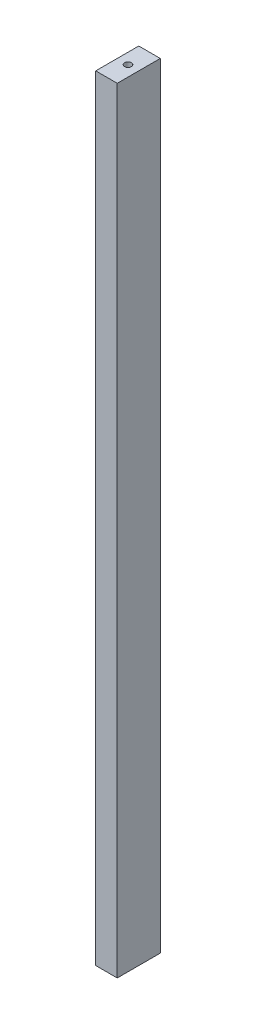
ISO-10303-21;
HEADER;
FILE_DESCRIPTION(('STEP AP214'),'2;1');
FILE_NAME('part.step','',(''),(''),'','','');
FILE_SCHEMA(('AUTOMOTIVE_DESIGN { 1 0 10303 214 1 1 1 1 }'));
ENDSEC;
DATA;
#1=APPLICATION_CONTEXT('core data for automotive mechanical design processes');
#2=APPLICATION_PROTOCOL_DEFINITION('international standard','automotive_design',2000,#1);
#3=PRODUCT_CONTEXT('',#1,'mechanical');
#4=PRODUCT('Part','Part','',(#3));
#5=PRODUCT_RELATED_PRODUCT_CATEGORY('part','',(#4));
#6=PRODUCT_DEFINITION_FORMATION('','',#4);
#7=PRODUCT_DEFINITION_CONTEXT('part definition',#1,'design');
#8=PRODUCT_DEFINITION('design','',#6,#7);
#9=PRODUCT_DEFINITION_SHAPE('','',#8);
#10=(LENGTH_UNIT() NAMED_UNIT(*) SI_UNIT(.MILLI.,.METRE.));
#11=(NAMED_UNIT(*) PLANE_ANGLE_UNIT() SI_UNIT($,.RADIAN.));
#12=(NAMED_UNIT(*) SI_UNIT($,.STERADIAN.) SOLID_ANGLE_UNIT());
#13=UNCERTAINTY_MEASURE_WITH_UNIT(LENGTH_MEASURE(1.E-05),#10,'distance_accuracy_value','');
#14=(GEOMETRIC_REPRESENTATION_CONTEXT(3) GLOBAL_UNCERTAINTY_ASSIGNED_CONTEXT((#13)) GLOBAL_UNIT_ASSIGNED_CONTEXT((#10,
#11,#12)) REPRESENTATION_CONTEXT('',''));
#15=CARTESIAN_POINT('',(0.,0.,0.));
#16=DIRECTION('',(0.,0.,1.));
#17=DIRECTION('',(1.,0.,0.));
#18=AXIS2_PLACEMENT_3D('',#15,#16,#17);
#19=CARTESIAN_POINT('',(-12.5,900.,-25.));
#20=DIRECTION('',(1.,0.,0.));
#21=DIRECTION('',(0.,0.,-1.));
#22=AXIS2_PLACEMENT_3D('',#19,#20,#21);
#23=PLANE('',#22);
#24=DIRECTION('',(0.,0.,1.));
#25=VECTOR('',#24,1.);
#26=CARTESIAN_POINT('',(-12.5,0.,-25.));
#27=LINE('',#26,#25);
#28=CARTESIAN_POINT('',(-12.5,0.,-25.));
#29=VERTEX_POINT('',#28);
#30=CARTESIAN_POINT('',(-12.5,0.,25.));
#31=VERTEX_POINT('',#30);
#32=EDGE_CURVE('E111',#29,#31,#27,.T.);
#33=ORIENTED_EDGE('',*,*,#32,.T.);
#34=DIRECTION('',(0.,-1.,0.));
#35=VECTOR('',#34,1.);
#36=CARTESIAN_POINT('',(-12.5,900.,25.));
#37=LINE('',#36,#35);
#38=CARTESIAN_POINT('',(-12.5,900.,25.));
#39=VERTEX_POINT('',#38);
#40=EDGE_CURVE('E11',#39,#31,#37,.T.);
#41=ORIENTED_EDGE('',*,*,#40,.F.);
#42=DIRECTION('',(0.,0.,1.));
#43=VECTOR('',#42,1.);
#44=CARTESIAN_POINT('',(-12.5,900.,-25.));
#45=LINE('',#44,#43);
#46=CARTESIAN_POINT('',(-12.5,900.,-25.));
#47=VERTEX_POINT('',#46);
#48=EDGE_CURVE('E95',#47,#39,#45,.T.);
#49=ORIENTED_EDGE('',*,*,#48,.F.);
#50=DIRECTION('',(0.,-1.,0.));
#51=VECTOR('',#50,1.);
#52=CARTESIAN_POINT('',(-12.5,900.,-25.));
#53=LINE('',#52,#51);
#54=EDGE_CURVE('E107',#47,#29,#53,.T.);
#55=ORIENTED_EDGE('',*,*,#54,.T.);
#56=EDGE_LOOP('',(#33,#41,#49,#55));
#57=FACE_BOUND('',#56,.T.);
#58=ADVANCED_FACE('F43',(#57),#23,.F.);
#59=CARTESIAN_POINT('',(12.5,900.,25.));
#60=DIRECTION('',(0.,0.,-1.));
#61=DIRECTION('',(-1.,0.,0.));
#62=AXIS2_PLACEMENT_3D('',#59,#60,#61);
#63=PLANE('',#62);
#64=DIRECTION('',(1.,0.,0.));
#65=VECTOR('',#64,1.);
#66=CARTESIAN_POINT('',(12.5,0.,25.));
#67=LINE('',#66,#65);
#68=CARTESIAN_POINT('',(12.5,0.,25.));
#69=VERTEX_POINT('',#68);
#70=EDGE_CURVE('E100',#31,#69,#67,.T.);
#71=ORIENTED_EDGE('',*,*,#70,.T.);
#72=DIRECTION('',(0.,-1.,0.));
#73=VECTOR('',#72,1.);
#74=CARTESIAN_POINT('',(12.5,900.,25.));
#75=LINE('',#74,#73);
#76=CARTESIAN_POINT('',(12.5,900.,25.));
#77=VERTEX_POINT('',#76);
#78=EDGE_CURVE('E52',#77,#69,#75,.T.);
#79=ORIENTED_EDGE('',*,*,#78,.F.);
#80=DIRECTION('',(1.,0.,0.));
#81=VECTOR('',#80,1.);
#82=CARTESIAN_POINT('',(12.5,900.,25.));
#83=LINE('',#82,#81);
#84=EDGE_CURVE('E90',#39,#77,#83,.T.);
#85=ORIENTED_EDGE('',*,*,#84,.F.);
#86=ORIENTED_EDGE('',*,*,#40,.T.);
#87=EDGE_LOOP('',(#71,#79,#85,#86));
#88=FACE_BOUND('',#87,.T.);
#89=ADVANCED_FACE('F99',(#88),#63,.F.);
#90=CARTESIAN_POINT('',(12.5,900.,-25.));
#91=DIRECTION('',(-1.,0.,0.));
#92=DIRECTION('',(0.,0.,1.));
#93=AXIS2_PLACEMENT_3D('',#90,#91,#92);
#94=PLANE('',#93);
#95=DIRECTION('',(0.,0.,-1.));
#96=VECTOR('',#95,1.);
#97=CARTESIAN_POINT('',(12.5,0.,-25.));
#98=LINE('',#97,#96);
#99=CARTESIAN_POINT('',(12.5,0.,-25.));
#100=VERTEX_POINT('',#99);
#101=EDGE_CURVE('E77',#69,#100,#98,.T.);
#102=ORIENTED_EDGE('',*,*,#101,.T.);
#103=DIRECTION('',(0.,-1.,0.));
#104=VECTOR('',#103,1.);
#105=CARTESIAN_POINT('',(12.5,900.,-25.));
#106=LINE('',#105,#104);
#107=CARTESIAN_POINT('',(12.5,900.,-25.));
#108=VERTEX_POINT('',#107);
#109=EDGE_CURVE('E102',#108,#100,#106,.T.);
#110=ORIENTED_EDGE('',*,*,#109,.F.);
#111=DIRECTION('',(0.,0.,-1.));
#112=VECTOR('',#111,1.);
#113=CARTESIAN_POINT('',(12.5,900.,-25.));
#114=LINE('',#113,#112);
#115=EDGE_CURVE('E93',#77,#108,#114,.T.);
#116=ORIENTED_EDGE('',*,*,#115,.F.);
#117=ORIENTED_EDGE('',*,*,#78,.T.);
#118=EDGE_LOOP('',(#102,#110,#116,#117));
#119=FACE_BOUND('',#118,.T.);
#120=ADVANCED_FACE('F103',(#119),#94,.F.);
#121=CARTESIAN_POINT('',(12.5,900.,-25.));
#122=DIRECTION('',(0.,0.,1.));
#123=DIRECTION('',(1.,0.,0.));
#124=AXIS2_PLACEMENT_3D('',#121,#122,#123);
#125=PLANE('',#124);
#126=DIRECTION('',(-1.,0.,0.));
#127=VECTOR('',#126,1.);
#128=CARTESIAN_POINT('',(12.5,0.,-25.));
#129=LINE('',#128,#127);
#130=EDGE_CURVE('E83',#100,#29,#129,.T.);
#131=ORIENTED_EDGE('',*,*,#130,.T.);
#132=ORIENTED_EDGE('',*,*,#54,.F.);
#133=DIRECTION('',(-1.,0.,0.));
#134=VECTOR('',#133,1.);
#135=CARTESIAN_POINT('',(12.5,900.,-25.));
#136=LINE('',#135,#134);
#137=EDGE_CURVE('E60',#108,#47,#136,.T.);
#138=ORIENTED_EDGE('',*,*,#137,.F.);
#139=ORIENTED_EDGE('',*,*,#109,.T.);
#140=EDGE_LOOP('',(#131,#132,#138,#139));
#141=FACE_BOUND('',#140,.T.);
#142=ADVANCED_FACE('F125',(#141),#125,.F.);
#143=CARTESIAN_POINT('',(0.,900.,0.));
#144=DIRECTION('',(0.,-1.,0.));
#145=DIRECTION('',(0.,0.,-1.));
#146=AXIS2_PLACEMENT_3D('',#143,#144,#145);
#147=PLANE('',#146);
#148=CARTESIAN_POINT('',(0.,900.,0.));
#149=DIRECTION('',(0.,1.,0.));
#150=DIRECTION('',(0.,0.,1.));
#151=AXIS2_PLACEMENT_3D('',#148,#149,#150);
#152=CIRCLE('',#151,4.);
#153=CARTESIAN_POINT('',(0.,900.,4.));
#154=VERTEX_POINT('',#153);
#155=EDGE_CURVE('E140',#154,#154,#152,.T.);
#156=ORIENTED_EDGE('',*,*,#155,.F.);
#157=EDGE_LOOP('',(#156));
#158=FACE_BOUND('',#157,.T.);
#159=ORIENTED_EDGE('',*,*,#48,.T.);
#160=ORIENTED_EDGE('',*,*,#84,.T.);
#161=ORIENTED_EDGE('',*,*,#115,.T.);
#162=ORIENTED_EDGE('',*,*,#137,.T.);
#163=EDGE_LOOP('',(#159,#160,#161,#162));
#164=FACE_BOUND('',#163,.T.);
#165=ADVANCED_FACE('F91',(#158,#164),#147,.F.);
#166=CARTESIAN_POINT('',(0.,0.,0.));
#167=DIRECTION('',(0.,-1.,0.));
#168=DIRECTION('',(0.,0.,-1.));
#169=AXIS2_PLACEMENT_3D('',#166,#167,#168);
#170=PLANE('',#169);
#171=CARTESIAN_POINT('',(0.,0.,0.));
#172=DIRECTION('',(0.,-1.,0.));
#173=DIRECTION('',(0.,0.,-1.));
#174=AXIS2_PLACEMENT_3D('',#171,#172,#173);
#175=CIRCLE('',#174,4.);
#176=CARTESIAN_POINT('',(0.,0.,-4.));
#177=VERTEX_POINT('',#176);
#178=EDGE_CURVE('E132',#177,#177,#175,.T.);
#179=ORIENTED_EDGE('',*,*,#178,.F.);
#180=EDGE_LOOP('',(#179));
#181=FACE_BOUND('',#180,.T.);
#182=ORIENTED_EDGE('',*,*,#32,.F.);
#183=ORIENTED_EDGE('',*,*,#130,.F.);
#184=ORIENTED_EDGE('',*,*,#101,.F.);
#185=ORIENTED_EDGE('',*,*,#70,.F.);
#186=EDGE_LOOP('',(#182,#183,#184,#185));
#187=FACE_BOUND('',#186,.T.);
#188=ADVANCED_FACE('F128',(#181,#187),#170,.T.);
#189=CARTESIAN_POINT('',(0.,10.,0.));
#190=DIRECTION('',(0.,-1.,0.));
#191=DIRECTION('',(0.,0.,-1.));
#192=AXIS2_PLACEMENT_3D('',#189,#190,#191);
#193=CYLINDRICAL_SURFACE('',#192,4.);
#194=CARTESIAN_POINT('',(0.,10.,0.));
#195=DIRECTION('',(0.,-1.,0.));
#196=DIRECTION('',(0.,0.,-1.));
#197=AXIS2_PLACEMENT_3D('',#194,#195,#196);
#198=CIRCLE('',#197,4.);
#199=CARTESIAN_POINT('',(0.,10.,-4.));
#200=VERTEX_POINT('',#199);
#201=EDGE_CURVE('E115',#200,#200,#198,.T.);
#202=ORIENTED_EDGE('',*,*,#201,.F.);
#203=EDGE_LOOP('',(#202));
#204=FACE_BOUND('',#203,.T.);
#205=ORIENTED_EDGE('',*,*,#178,.T.);
#206=EDGE_LOOP('',(#205));
#207=FACE_BOUND('',#206,.T.);
#208=ADVANCED_FACE('F163',(#204,#207),#193,.F.);
#209=CARTESIAN_POINT('',(0.,10.,0.));
#210=DIRECTION('',(0.,-1.,0.));
#211=DIRECTION('',(0.,0.,-1.));
#212=AXIS2_PLACEMENT_3D('',#209,#210,#211);
#213=PLANE('',#212);
#214=ORIENTED_EDGE('',*,*,#201,.T.);
#215=EDGE_LOOP('',(#214));
#216=FACE_BOUND('',#215,.T.);
#217=ADVANCED_FACE('F153',(#216),#213,.T.);
#218=CARTESIAN_POINT('',(0.,890.,0.));
#219=DIRECTION('',(0.,1.,0.));
#220=DIRECTION('',(0.,0.,1.));
#221=AXIS2_PLACEMENT_3D('',#218,#219,#220);
#222=CYLINDRICAL_SURFACE('',#221,4.);
#223=CARTESIAN_POINT('',(0.,890.,0.));
#224=DIRECTION('',(0.,1.,0.));
#225=DIRECTION('',(0.,0.,1.));
#226=AXIS2_PLACEMENT_3D('',#223,#224,#225);
#227=CIRCLE('',#226,4.);
#228=CARTESIAN_POINT('',(0.,890.,4.));
#229=VERTEX_POINT('',#228);
#230=EDGE_CURVE('E136',#229,#229,#227,.T.);
#231=ORIENTED_EDGE('',*,*,#230,.F.);
#232=EDGE_LOOP('',(#231));
#233=FACE_BOUND('',#232,.T.);
#234=ORIENTED_EDGE('',*,*,#155,.T.);
#235=EDGE_LOOP('',(#234));
#236=FACE_BOUND('',#235,.T.);
#237=ADVANCED_FACE('F150',(#233,#236),#222,.F.);
#238=CARTESIAN_POINT('',(0.,890.,0.));
#239=DIRECTION('',(0.,1.,0.));
#240=DIRECTION('',(0.,0.,1.));
#241=AXIS2_PLACEMENT_3D('',#238,#239,#240);
#242=PLANE('',#241);
#243=ORIENTED_EDGE('',*,*,#230,.T.);
#244=EDGE_LOOP('',(#243));
#245=FACE_BOUND('',#244,.T.);
#246=ADVANCED_FACE('F148',(#245),#242,.T.);
#247=CLOSED_SHELL('',(#58,#89,#120,#142,#165,#188,#208,#217,#237,#246));
#248=MANIFOLD_SOLID_BREP('B2',#247);
#249=ADVANCED_BREP_SHAPE_REPRESENTATION('',(#18,#248),#14);
#250=SHAPE_DEFINITION_REPRESENTATION(#9,#249);
ENDSEC;
END-ISO-10303-21;
